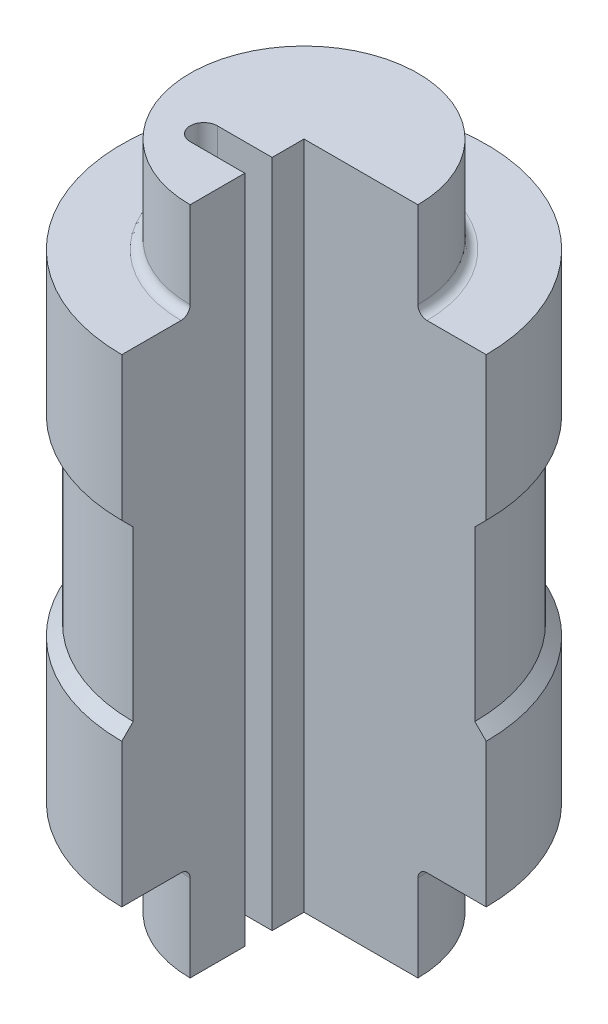
ISO-10303-21;
HEADER;
FILE_DESCRIPTION(('STEP AP214'),'2;1');
FILE_NAME('part.step','',(''),(''),'','','');
FILE_SCHEMA(('AUTOMOTIVE_DESIGN { 1 0 10303 214 1 1 1 1 }'));
ENDSEC;
DATA;
#1=APPLICATION_CONTEXT('core data for automotive mechanical design processes');
#2=APPLICATION_PROTOCOL_DEFINITION('international standard','automotive_design',2000,#1);
#3=PRODUCT_CONTEXT('',#1,'mechanical');
#4=PRODUCT('Part','Part','',(#3));
#5=PRODUCT_RELATED_PRODUCT_CATEGORY('part','',(#4));
#6=PRODUCT_DEFINITION_FORMATION('','',#4);
#7=PRODUCT_DEFINITION_CONTEXT('part definition',#1,'design');
#8=PRODUCT_DEFINITION('design','',#6,#7);
#9=PRODUCT_DEFINITION_SHAPE('','',#8);
#10=(LENGTH_UNIT() NAMED_UNIT(*) SI_UNIT(.MILLI.,.METRE.));
#11=(NAMED_UNIT(*) PLANE_ANGLE_UNIT() SI_UNIT($,.RADIAN.));
#12=(NAMED_UNIT(*) SI_UNIT($,.STERADIAN.) SOLID_ANGLE_UNIT());
#13=UNCERTAINTY_MEASURE_WITH_UNIT(LENGTH_MEASURE(1.E-05),#10,'distance_accuracy_value','');
#14=(GEOMETRIC_REPRESENTATION_CONTEXT(3) GLOBAL_UNCERTAINTY_ASSIGNED_CONTEXT((#13)) GLOBAL_UNIT_ASSIGNED_CONTEXT((#10,
#11,#12)) REPRESENTATION_CONTEXT('',''));
#15=CARTESIAN_POINT('',(0.,0.,0.));
#16=DIRECTION('',(0.,0.,1.));
#17=DIRECTION('',(1.,0.,0.));
#18=AXIS2_PLACEMENT_3D('',#15,#16,#17);
#19=CARTESIAN_POINT('',(0.,126.,0.));
#20=DIRECTION('',(-1.,0.,0.));
#21=DIRECTION('',(0.,0.,1.));
#22=AXIS2_PLACEMENT_3D('',#19,#20,#21);
#23=PLANE('',#22);
#24=DIRECTION('',(0.,0.,-1.));
#25=VECTOR('',#24,1.);
#26=CARTESIAN_POINT('',(0.,-21.,0.));
#27=LINE('',#26,#25);
#28=CARTESIAN_POINT('',(0.,-21.,25.));
#29=VERTEX_POINT('',#28);
#30=CARTESIAN_POINT('',(0.,-21.,13.));
#31=VERTEX_POINT('',#30);
#32=EDGE_CURVE('E199',#29,#31,#27,.T.);
#33=ORIENTED_EDGE('',*,*,#32,.T.);
#34=DIRECTION('',(0.,1.,0.));
#35=VECTOR('',#34,1.);
#36=CARTESIAN_POINT('',(0.,126.,13.));
#37=LINE('',#36,#35);
#38=CARTESIAN_POINT('',(0.,126.,13.));
#39=VERTEX_POINT('',#38);
#40=EDGE_CURVE('E11',#31,#39,#37,.T.);
#41=ORIENTED_EDGE('',*,*,#40,.T.);
#42=DIRECTION('',(0.,0.,-1.));
#43=VECTOR('',#42,1.);
#44=CARTESIAN_POINT('',(0.,126.,0.));
#45=LINE('',#44,#43);
#46=CARTESIAN_POINT('',(0.,126.,25.));
#47=VERTEX_POINT('',#46);
#48=EDGE_CURVE('E192',#47,#39,#45,.T.);
#49=ORIENTED_EDGE('',*,*,#48,.F.);
#50=DIRECTION('',(0.,-1.,0.));
#51=VECTOR('',#50,1.);
#52=CARTESIAN_POINT('',(0.,126.,25.));
#53=LINE('',#52,#51);
#54=CARTESIAN_POINT('',(0.,107.,25.));
#55=VERTEX_POINT('',#54);
#56=EDGE_CURVE('E253',#55,#47,#53,.F.);
#57=ORIENTED_EDGE('',*,*,#56,.F.);
#58=CARTESIAN_POINT('',(0.,107.,27.));
#59=DIRECTION('',(-1.,0.,0.));
#60=DIRECTION('',(0.,0.,1.));
#61=AXIS2_PLACEMENT_3D('',#58,#59,#60);
#62=CIRCLE('',#61,2.);
#63=CARTESIAN_POINT('',(0.,105.,27.));
#64=VERTEX_POINT('',#63);
#65=EDGE_CURVE('E250',#64,#55,#62,.F.);
#66=ORIENTED_EDGE('',*,*,#65,.F.);
#67=DIRECTION('',(0.,0.,1.));
#68=VECTOR('',#67,1.);
#69=CARTESIAN_POINT('',(0.,105.,0.));
#70=LINE('',#69,#68);
#71=CARTESIAN_POINT('',(0.,105.,40.));
#72=VERTEX_POINT('',#71);
#73=EDGE_CURVE('E248',#64,#72,#70,.T.);
#74=ORIENTED_EDGE('',*,*,#73,.T.);
#75=DIRECTION('',(0.,-1.,0.));
#76=VECTOR('',#75,1.);
#77=CARTESIAN_POINT('',(0.,105.,40.));
#78=LINE('',#77,#76);
#79=CARTESIAN_POINT('',(0.,73.5,40.));
#80=VERTEX_POINT('',#79);
#81=EDGE_CURVE('E245',#80,#72,#78,.F.);
#82=ORIENTED_EDGE('',*,*,#81,.F.);
#83=DIRECTION('',(0.,0.707106781186549,0.707106781186546));
#84=VECTOR('',#83,1.);
#85=CARTESIAN_POINT('',(0.,33.4999999999998,0.));
#86=LINE('',#85,#84);
#87=CARTESIAN_POINT('',(0.,71.,37.5));
#88=VERTEX_POINT('',#87);
#89=EDGE_CURVE('E243',#80,#88,#86,.F.);
#90=ORIENTED_EDGE('',*,*,#89,.T.);
#91=DIRECTION('',(0.,1.,0.));
#92=VECTOR('',#91,1.);
#93=CARTESIAN_POINT('',(0.,105.,37.5));
#94=LINE('',#93,#92);
#95=CARTESIAN_POINT('',(0.,34.,37.5));
#96=VERTEX_POINT('',#95);
#97=EDGE_CURVE('E241',#88,#96,#94,.F.);
#98=ORIENTED_EDGE('',*,*,#97,.T.);
#99=DIRECTION('',(0.,0.707106781186552,-0.707106781186543));
#100=VECTOR('',#99,1.);
#101=CARTESIAN_POINT('',(0.,71.5000000000006,0.));
#102=LINE('',#101,#100);
#103=CARTESIAN_POINT('',(0.,31.5,40.));
#104=VERTEX_POINT('',#103);
#105=EDGE_CURVE('E239',#96,#104,#102,.F.);
#106=ORIENTED_EDGE('',*,*,#105,.T.);
#107=DIRECTION('',(0.,-1.,0.));
#108=VECTOR('',#107,1.);
#109=CARTESIAN_POINT('',(0.,105.,40.));
#110=LINE('',#109,#108);
#111=CARTESIAN_POINT('',(0.,0.,40.));
#112=VERTEX_POINT('',#111);
#113=EDGE_CURVE('E294',#112,#104,#110,.F.);
#114=ORIENTED_EDGE('',*,*,#113,.F.);
#115=DIRECTION('',(0.,0.,1.));
#116=VECTOR('',#115,1.);
#117=CARTESIAN_POINT('',(0.,0.,0.));
#118=LINE('',#117,#116);
#119=CARTESIAN_POINT('',(0.,0.,27.));
#120=VERTEX_POINT('',#119);
#121=EDGE_CURVE('E230',#120,#112,#118,.T.);
#122=ORIENTED_EDGE('',*,*,#121,.F.);
#123=CARTESIAN_POINT('',(0.,-2.,27.));
#124=DIRECTION('',(-1.,0.,0.));
#125=DIRECTION('',(0.,0.,1.));
#126=AXIS2_PLACEMENT_3D('',#123,#124,#125);
#127=CIRCLE('',#126,2.);
#128=CARTESIAN_POINT('',(0.,-2.,25.));
#129=VERTEX_POINT('',#128);
#130=EDGE_CURVE('E233',#129,#120,#127,.F.);
#131=ORIENTED_EDGE('',*,*,#130,.F.);
#132=DIRECTION('',(0.,1.,0.));
#133=VECTOR('',#132,1.);
#134=CARTESIAN_POINT('',(0.,-21.,25.));
#135=LINE('',#134,#133);
#136=EDGE_CURVE('E236',#29,#129,#135,.T.);
#137=ORIENTED_EDGE('',*,*,#136,.F.);
#138=EDGE_LOOP('',(#33,#41,#49,#57,#66,#74,#82,#90,#98,#106,#114,#122,#131,#137));
#139=FACE_BOUND('',#138,.T.);
#140=ADVANCED_FACE('F44',(#139),#23,.F.);
#141=CARTESIAN_POINT('',(0.,105.,0.));
#142=DIRECTION('',(0.,-1.,0.));
#143=DIRECTION('',(0.,0.,-1.));
#144=AXIS2_PLACEMENT_3D('',#141,#142,#143);
#145=CYLINDRICAL_SURFACE('',#144,40.);
#146=CARTESIAN_POINT('',(0.,73.5,0.));
#147=DIRECTION('',(0.,1.,0.));
#148=DIRECTION('',(0.,0.,1.));
#149=AXIS2_PLACEMENT_3D('',#146,#147,#148);
#150=CIRCLE('',#149,40.);
#151=CARTESIAN_POINT('',(40.,73.5,0.));
#152=VERTEX_POINT('',#151);
#153=EDGE_CURVE('E265',#152,#80,#150,.T.);
#154=ORIENTED_EDGE('',*,*,#153,.T.);
#155=ORIENTED_EDGE('',*,*,#81,.T.);
#156=CARTESIAN_POINT('',(0.,105.,0.));
#157=DIRECTION('',(0.,1.,0.));
#158=DIRECTION('',(0.,0.,1.));
#159=AXIS2_PLACEMENT_3D('',#156,#157,#158);
#160=CIRCLE('',#159,40.);
#161=CARTESIAN_POINT('',(40.,105.,0.));
#162=VERTEX_POINT('',#161);
#163=EDGE_CURVE('E275',#162,#72,#160,.T.);
#164=ORIENTED_EDGE('',*,*,#163,.F.);
#165=DIRECTION('',(0.,-1.,0.));
#166=VECTOR('',#165,1.);
#167=CARTESIAN_POINT('',(40.,105.,0.));
#168=LINE('',#167,#166);
#169=EDGE_CURVE('E219',#162,#152,#168,.T.);
#170=ORIENTED_EDGE('',*,*,#169,.T.);
#171=EDGE_LOOP('',(#154,#155,#164,#170));
#172=FACE_BOUND('',#171,.T.);
#173=ADVANCED_FACE('F336',(#172),#145,.T.);
#174=CARTESIAN_POINT('',(0.,105.,0.));
#175=DIRECTION('',(0.,1.,0.));
#176=DIRECTION('',(0.,0.,1.));
#177=AXIS2_PLACEMENT_3D('',#174,#175,#176);
#178=PLANE('',#177);
#179=ORIENTED_EDGE('',*,*,#73,.F.);
#180=CARTESIAN_POINT('',(0.,105.,0.));
#181=DIRECTION('',(0.,1.,0.));
#182=DIRECTION('',(0.,0.,1.));
#183=AXIS2_PLACEMENT_3D('',#180,#181,#182);
#184=CIRCLE('',#183,27.);
#185=CARTESIAN_POINT('',(27.,105.,0.));
#186=VERTEX_POINT('',#185);
#187=EDGE_CURVE('E289',#64,#186,#184,.F.);
#188=ORIENTED_EDGE('',*,*,#187,.T.);
#189=DIRECTION('',(-1.,0.,0.));
#190=VECTOR('',#189,1.);
#191=CARTESIAN_POINT('',(0.,105.,0.));
#192=LINE('',#191,#190);
#193=EDGE_CURVE('E222',#162,#186,#192,.T.);
#194=ORIENTED_EDGE('',*,*,#193,.F.);
#195=ORIENTED_EDGE('',*,*,#163,.T.);
#196=EDGE_LOOP('',(#179,#188,#194,#195));
#197=FACE_BOUND('',#196,.T.);
#198=ADVANCED_FACE('F341',(#197),#178,.T.);
#199=CARTESIAN_POINT('',(0.,126.,0.));
#200=DIRECTION('',(0.,-1.,0.));
#201=DIRECTION('',(0.,0.,-1.));
#202=AXIS2_PLACEMENT_3D('',#199,#200,#201);
#203=CYLINDRICAL_SURFACE('',#202,25.);
#204=CARTESIAN_POINT('',(0.,107.,0.));
#205=DIRECTION('',(0.,1.,0.));
#206=DIRECTION('',(0.,0.,1.));
#207=AXIS2_PLACEMENT_3D('',#204,#205,#206);
#208=CIRCLE('',#207,25.);
#209=CARTESIAN_POINT('',(25.,107.,0.));
#210=VERTEX_POINT('',#209);
#211=EDGE_CURVE('E286',#210,#55,#208,.T.);
#212=ORIENTED_EDGE('',*,*,#211,.T.);
#213=ORIENTED_EDGE('',*,*,#56,.T.);
#214=CARTESIAN_POINT('',(0.,126.,0.));
#215=DIRECTION('',(0.,1.,0.));
#216=DIRECTION('',(0.,0.,1.));
#217=AXIS2_PLACEMENT_3D('',#214,#215,#216);
#218=CIRCLE('',#217,25.);
#219=CARTESIAN_POINT('',(25.,126.,0.));
#220=VERTEX_POINT('',#219);
#221=EDGE_CURVE('E271',#220,#47,#218,.T.);
#222=ORIENTED_EDGE('',*,*,#221,.F.);
#223=DIRECTION('',(0.,-1.,0.));
#224=VECTOR('',#223,1.);
#225=CARTESIAN_POINT('',(25.,126.,0.));
#226=LINE('',#225,#224);
#227=EDGE_CURVE('E227',#220,#210,#226,.T.);
#228=ORIENTED_EDGE('',*,*,#227,.T.);
#229=EDGE_LOOP('',(#212,#213,#222,#228));
#230=FACE_BOUND('',#229,.T.);
#231=ADVANCED_FACE('F347',(#230),#203,.T.);
#232=CARTESIAN_POINT('',(0.,126.,0.));
#233=DIRECTION('',(0.,1.,0.));
#234=DIRECTION('',(0.,0.,1.));
#235=AXIS2_PLACEMENT_3D('',#232,#233,#234);
#236=PLANE('',#235);
#237=DIRECTION('',(-1.,0.,0.));
#238=VECTOR('',#237,1.);
#239=CARTESIAN_POINT('',(-12.,126.,13.));
#240=LINE('',#239,#238);
#241=CARTESIAN_POINT('',(-12.,126.,13.));
#242=VERTEX_POINT('',#241);
#243=EDGE_CURVE('E173',#39,#242,#240,.T.);
#244=ORIENTED_EDGE('',*,*,#243,.T.);
#245=CARTESIAN_POINT('',(-12.,126.,10.));
#246=DIRECTION('',(0.,-1.,0.));
#247=DIRECTION('',(0.,0.,-1.));
#248=AXIS2_PLACEMENT_3D('',#245,#246,#247);
#249=CIRCLE('',#248,3.);
#250=CARTESIAN_POINT('',(-12.,126.,7.));
#251=VERTEX_POINT('',#250);
#252=EDGE_CURVE('E168',#242,#251,#249,.T.);
#253=ORIENTED_EDGE('',*,*,#252,.T.);
#254=DIRECTION('',(1.,0.,0.));
#255=VECTOR('',#254,1.);
#256=CARTESIAN_POINT('',(-12.,126.,7.));
#257=LINE('',#256,#255);
#258=CARTESIAN_POINT('',(0.,126.,7.));
#259=VERTEX_POINT('',#258);
#260=EDGE_CURVE('E176',#251,#259,#257,.T.);
#261=ORIENTED_EDGE('',*,*,#260,.T.);
#262=CARTESIAN_POINT('',(0.,126.,0.));
#263=VERTEX_POINT('',#262);
#264=EDGE_CURVE('E195',#259,#263,#45,.T.);
#265=ORIENTED_EDGE('',*,*,#264,.T.);
#266=DIRECTION('',(1.,0.,0.));
#267=VECTOR('',#266,1.);
#268=CARTESIAN_POINT('',(0.,126.,0.));
#269=LINE('',#268,#267);
#270=EDGE_CURVE('E194',#263,#220,#269,.T.);
#271=ORIENTED_EDGE('',*,*,#270,.T.);
#272=ORIENTED_EDGE('',*,*,#221,.T.);
#273=ORIENTED_EDGE('',*,*,#48,.T.);
#274=EDGE_LOOP('',(#244,#253,#261,#265,#271,#272,#273));
#275=FACE_BOUND('',#274,.T.);
#276=ADVANCED_FACE('F181',(#275),#236,.T.);
#277=CARTESIAN_POINT('',(0.,107.,0.));
#278=DIRECTION('',(0.,1.,0.));
#279=DIRECTION('',(0.,0.,1.));
#280=AXIS2_PLACEMENT_3D('',#277,#278,#279);
#281=TOROIDAL_SURFACE('',#280,27.,2.);
#282=ORIENTED_EDGE('',*,*,#187,.F.);
#283=ORIENTED_EDGE('',*,*,#65,.T.);
#284=ORIENTED_EDGE('',*,*,#211,.F.);
#285=CARTESIAN_POINT('',(27.,107.,0.));
#286=DIRECTION('',(0.,0.,-1.));
#287=DIRECTION('',(-1.,0.,0.));
#288=AXIS2_PLACEMENT_3D('',#285,#286,#287);
#289=CIRCLE('',#288,2.);
#290=EDGE_CURVE('E224',#210,#186,#289,.F.);
#291=ORIENTED_EDGE('',*,*,#290,.T.);
#292=EDGE_LOOP('',(#282,#283,#284,#291));
#293=FACE_BOUND('',#292,.T.);
#294=ADVANCED_FACE('F46',(#293),#281,.F.);
#295=CARTESIAN_POINT('',(0.,73.5,0.));
#296=DIRECTION('',(0.,1.,0.));
#297=DIRECTION('',(0.,0.,1.));
#298=AXIS2_PLACEMENT_3D('',#295,#296,#297);
#299=CONICAL_SURFACE('',#298,40.,0.785398163397446);
#300=ORIENTED_EDGE('',*,*,#89,.F.);
#301=ORIENTED_EDGE('',*,*,#153,.F.);
#302=DIRECTION('',(-0.707106781186546,-0.707106781186549,0.));
#303=VECTOR('',#302,1.);
#304=CARTESIAN_POINT('',(0.,33.4999999999998,0.));
#305=LINE('',#304,#303);
#306=CARTESIAN_POINT('',(37.5,71.,0.));
#307=VERTEX_POINT('',#306);
#308=EDGE_CURVE('E217',#307,#152,#305,.F.);
#309=ORIENTED_EDGE('',*,*,#308,.F.);
#310=CARTESIAN_POINT('',(0.,71.,0.));
#311=DIRECTION('',(0.,1.,0.));
#312=DIRECTION('',(0.,0.,1.));
#313=AXIS2_PLACEMENT_3D('',#310,#311,#312);
#314=CIRCLE('',#313,37.5);
#315=EDGE_CURVE('E262',#307,#88,#314,.T.);
#316=ORIENTED_EDGE('',*,*,#315,.T.);
#317=EDGE_LOOP('',(#300,#301,#309,#316));
#318=FACE_BOUND('',#317,.T.);
#319=ADVANCED_FACE('F334',(#318),#299,.T.);
#320=CARTESIAN_POINT('',(0.,105.,0.));
#321=DIRECTION('',(0.,1.,0.));
#322=DIRECTION('',(0.,0.,1.));
#323=AXIS2_PLACEMENT_3D('',#320,#321,#322);
#324=CYLINDRICAL_SURFACE('',#323,37.5);
#325=ORIENTED_EDGE('',*,*,#97,.F.);
#326=ORIENTED_EDGE('',*,*,#315,.F.);
#327=DIRECTION('',(0.,1.,0.));
#328=VECTOR('',#327,1.);
#329=CARTESIAN_POINT('',(37.5,105.,0.));
#330=LINE('',#329,#328);
#331=CARTESIAN_POINT('',(37.5,34.,0.));
#332=VERTEX_POINT('',#331);
#333=EDGE_CURVE('E215',#332,#307,#330,.T.);
#334=ORIENTED_EDGE('',*,*,#333,.F.);
#335=CARTESIAN_POINT('',(0.,34.,0.));
#336=DIRECTION('',(0.,1.,0.));
#337=DIRECTION('',(0.,0.,1.));
#338=AXIS2_PLACEMENT_3D('',#335,#336,#337);
#339=CIRCLE('',#338,37.5);
#340=EDGE_CURVE('E259',#332,#96,#339,.T.);
#341=ORIENTED_EDGE('',*,*,#340,.T.);
#342=EDGE_LOOP('',(#325,#326,#334,#341));
#343=FACE_BOUND('',#342,.T.);
#344=ADVANCED_FACE('F328',(#343),#324,.T.);
#345=CARTESIAN_POINT('',(0.,34.,0.));
#346=DIRECTION('',(0.,-1.,0.));
#347=DIRECTION('',(0.,0.,-1.));
#348=AXIS2_PLACEMENT_3D('',#345,#346,#347);
#349=CONICAL_SURFACE('',#348,37.5,0.785398163397442);
#350=ORIENTED_EDGE('',*,*,#105,.F.);
#351=ORIENTED_EDGE('',*,*,#340,.F.);
#352=DIRECTION('',(0.707106781186543,-0.707106781186552,0.));
#353=VECTOR('',#352,1.);
#354=CARTESIAN_POINT('',(0.,71.5000000000006,0.));
#355=LINE('',#354,#353);
#356=CARTESIAN_POINT('',(40.,31.5,0.));
#357=VERTEX_POINT('',#356);
#358=EDGE_CURVE('E213',#357,#332,#355,.F.);
#359=ORIENTED_EDGE('',*,*,#358,.F.);
#360=CARTESIAN_POINT('',(0.,31.5,0.));
#361=DIRECTION('',(0.,1.,0.));
#362=DIRECTION('',(0.,0.,1.));
#363=AXIS2_PLACEMENT_3D('',#360,#361,#362);
#364=CIRCLE('',#363,40.);
#365=EDGE_CURVE('E256',#357,#104,#364,.T.);
#366=ORIENTED_EDGE('',*,*,#365,.T.);
#367=EDGE_LOOP('',(#350,#351,#359,#366));
#368=FACE_BOUND('',#367,.T.);
#369=ADVANCED_FACE('F325',(#368),#349,.T.);
#370=CARTESIAN_POINT('',(0.,-21.,0.));
#371=DIRECTION('',(0.,-1.,0.));
#372=DIRECTION('',(0.,0.,-1.));
#373=AXIS2_PLACEMENT_3D('',#370,#371,#372);
#374=PLANE('',#373);
#375=DIRECTION('',(-1.,0.,0.));
#376=VECTOR('',#375,1.);
#377=CARTESIAN_POINT('',(-12.,-21.,13.));
#378=LINE('',#377,#376);
#379=CARTESIAN_POINT('',(-12.,-21.,13.));
#380=VERTEX_POINT('',#379);
#381=EDGE_CURVE('E183',#31,#380,#378,.T.);
#382=ORIENTED_EDGE('',*,*,#381,.F.);
#383=ORIENTED_EDGE('',*,*,#32,.F.);
#384=CARTESIAN_POINT('',(0.,-21.,0.));
#385=DIRECTION('',(0.,-1.,0.));
#386=DIRECTION('',(0.,0.,-1.));
#387=AXIS2_PLACEMENT_3D('',#384,#385,#386);
#388=CIRCLE('',#387,25.);
#389=CARTESIAN_POINT('',(25.,-21.,0.));
#390=VERTEX_POINT('',#389);
#391=EDGE_CURVE('E268',#29,#390,#388,.T.);
#392=ORIENTED_EDGE('',*,*,#391,.T.);
#393=DIRECTION('',(1.,0.,0.));
#394=VECTOR('',#393,1.);
#395=CARTESIAN_POINT('',(0.,-21.,0.));
#396=LINE('',#395,#394);
#397=CARTESIAN_POINT('',(0.,-21.,0.));
#398=VERTEX_POINT('',#397);
#399=EDGE_CURVE('E202',#398,#390,#396,.T.);
#400=ORIENTED_EDGE('',*,*,#399,.F.);
#401=CARTESIAN_POINT('',(0.,-21.,7.));
#402=VERTEX_POINT('',#401);
#403=EDGE_CURVE('E190',#402,#398,#27,.T.);
#404=ORIENTED_EDGE('',*,*,#403,.F.);
#405=DIRECTION('',(1.,0.,0.));
#406=VECTOR('',#405,1.);
#407=CARTESIAN_POINT('',(-12.,-21.,7.));
#408=LINE('',#407,#406);
#409=CARTESIAN_POINT('',(-12.,-21.,7.));
#410=VERTEX_POINT('',#409);
#411=EDGE_CURVE('E59',#410,#402,#408,.T.);
#412=ORIENTED_EDGE('',*,*,#411,.F.);
#413=CARTESIAN_POINT('',(-12.,-21.,10.));
#414=DIRECTION('',(0.,-1.,0.));
#415=DIRECTION('',(0.,0.,-1.));
#416=AXIS2_PLACEMENT_3D('',#413,#414,#415);
#417=CIRCLE('',#416,3.);
#418=EDGE_CURVE('E171',#380,#410,#417,.T.);
#419=ORIENTED_EDGE('',*,*,#418,.F.);
#420=EDGE_LOOP('',(#382,#383,#392,#400,#404,#412,#419));
#421=FACE_BOUND('',#420,.T.);
#422=ADVANCED_FACE('F303',(#421),#374,.T.);
#423=CARTESIAN_POINT('',(0.,-21.,0.));
#424=DIRECTION('',(0.,1.,0.));
#425=DIRECTION('',(0.,0.,1.));
#426=AXIS2_PLACEMENT_3D('',#423,#424,#425);
#427=CYLINDRICAL_SURFACE('',#426,25.);
#428=ORIENTED_EDGE('',*,*,#391,.F.);
#429=ORIENTED_EDGE('',*,*,#136,.T.);
#430=CARTESIAN_POINT('',(0.,-2.,0.));
#431=DIRECTION('',(0.,1.,0.));
#432=DIRECTION('',(0.,0.,1.));
#433=AXIS2_PLACEMENT_3D('',#430,#431,#432);
#434=CIRCLE('',#433,25.);
#435=CARTESIAN_POINT('',(25.,-2.,0.));
#436=VERTEX_POINT('',#435);
#437=EDGE_CURVE('E278',#129,#436,#434,.F.);
#438=ORIENTED_EDGE('',*,*,#437,.T.);
#439=DIRECTION('',(0.,1.,0.));
#440=VECTOR('',#439,1.);
#441=CARTESIAN_POINT('',(25.,-21.,0.));
#442=LINE('',#441,#440);
#443=EDGE_CURVE('E210',#436,#390,#442,.F.);
#444=ORIENTED_EDGE('',*,*,#443,.T.);
#445=EDGE_LOOP('',(#428,#429,#438,#444));
#446=FACE_BOUND('',#445,.T.);
#447=ADVANCED_FACE('F309',(#446),#427,.T.);
#448=CARTESIAN_POINT('',(0.,-2.,0.));
#449=DIRECTION('',(0.,1.,0.));
#450=DIRECTION('',(0.,0.,1.));
#451=AXIS2_PLACEMENT_3D('',#448,#449,#450);
#452=TOROIDAL_SURFACE('',#451,27.,2.);
#453=ORIENTED_EDGE('',*,*,#437,.F.);
#454=ORIENTED_EDGE('',*,*,#130,.T.);
#455=CARTESIAN_POINT('',(0.,0.,0.));
#456=DIRECTION('',(0.,1.,0.));
#457=DIRECTION('',(0.,0.,1.));
#458=AXIS2_PLACEMENT_3D('',#455,#456,#457);
#459=CIRCLE('',#458,27.);
#460=CARTESIAN_POINT('',(27.,0.,0.));
#461=VERTEX_POINT('',#460);
#462=EDGE_CURVE('E283',#461,#120,#459,.T.);
#463=ORIENTED_EDGE('',*,*,#462,.F.);
#464=CARTESIAN_POINT('',(27.,-2.,0.));
#465=DIRECTION('',(0.,0.,-1.));
#466=DIRECTION('',(-1.,0.,0.));
#467=AXIS2_PLACEMENT_3D('',#464,#465,#466);
#468=CIRCLE('',#467,2.);
#469=EDGE_CURVE('E207',#461,#436,#468,.F.);
#470=ORIENTED_EDGE('',*,*,#469,.T.);
#471=EDGE_LOOP('',(#453,#454,#463,#470));
#472=FACE_BOUND('',#471,.T.);
#473=ADVANCED_FACE('F312',(#472),#452,.F.);
#474=CARTESIAN_POINT('',(0.,0.,0.));
#475=DIRECTION('',(0.,1.,0.));
#476=DIRECTION('',(0.,0.,1.));
#477=AXIS2_PLACEMENT_3D('',#474,#475,#476);
#478=PLANE('',#477);
#479=ORIENTED_EDGE('',*,*,#462,.T.);
#480=ORIENTED_EDGE('',*,*,#121,.T.);
#481=CARTESIAN_POINT('',(0.,0.,0.));
#482=DIRECTION('',(0.,1.,0.));
#483=DIRECTION('',(0.,0.,1.));
#484=AXIS2_PLACEMENT_3D('',#481,#482,#483);
#485=CIRCLE('',#484,40.);
#486=CARTESIAN_POINT('',(40.,0.,0.));
#487=VERTEX_POINT('',#486);
#488=EDGE_CURVE('E274',#487,#112,#485,.T.);
#489=ORIENTED_EDGE('',*,*,#488,.F.);
#490=DIRECTION('',(-1.,0.,0.));
#491=VECTOR('',#490,1.);
#492=CARTESIAN_POINT('',(0.,0.,0.));
#493=LINE('',#492,#491);
#494=EDGE_CURVE('E67',#487,#461,#493,.T.);
#495=ORIENTED_EDGE('',*,*,#494,.T.);
#496=EDGE_LOOP('',(#479,#480,#489,#495));
#497=FACE_BOUND('',#496,.T.);
#498=ADVANCED_FACE('F316',(#497),#478,.F.);
#499=ORIENTED_EDGE('',*,*,#488,.T.);
#500=ORIENTED_EDGE('',*,*,#113,.T.);
#501=ORIENTED_EDGE('',*,*,#365,.F.);
#502=DIRECTION('',(0.,-1.,0.));
#503=VECTOR('',#502,1.);
#504=CARTESIAN_POINT('',(40.,105.,0.));
#505=LINE('',#504,#503);
#506=EDGE_CURVE('E292',#357,#487,#505,.T.);
#507=ORIENTED_EDGE('',*,*,#506,.T.);
#508=EDGE_LOOP('',(#499,#500,#501,#507));
#509=FACE_BOUND('',#508,.T.);
#510=ADVANCED_FACE('F318',(#509),#145,.T.);
#511=ORIENTED_EDGE('',*,*,#264,.F.);
#512=DIRECTION('',(0.,-1.,0.));
#513=VECTOR('',#512,1.);
#514=CARTESIAN_POINT('',(0.,126.,7.));
#515=LINE('',#514,#513);
#516=EDGE_CURVE('E52',#259,#402,#515,.T.);
#517=ORIENTED_EDGE('',*,*,#516,.T.);
#518=ORIENTED_EDGE('',*,*,#403,.T.);
#519=DIRECTION('',(0.,-1.,0.));
#520=VECTOR('',#519,1.);
#521=CARTESIAN_POINT('',(0.,126.,0.));
#522=LINE('',#521,#520);
#523=EDGE_CURVE('E198',#263,#398,#522,.T.);
#524=ORIENTED_EDGE('',*,*,#523,.F.);
#525=EDGE_LOOP('',(#511,#517,#518,#524));
#526=FACE_BOUND('',#525,.T.);
#527=ADVANCED_FACE('F298',(#526),#23,.F.);
#528=CARTESIAN_POINT('',(0.,126.,0.));
#529=DIRECTION('',(0.,0.,-1.));
#530=DIRECTION('',(-1.,0.,0.));
#531=AXIS2_PLACEMENT_3D('',#528,#529,#530);
#532=PLANE('',#531);
#533=ORIENTED_EDGE('',*,*,#270,.F.);
#534=ORIENTED_EDGE('',*,*,#523,.T.);
#535=ORIENTED_EDGE('',*,*,#399,.T.);
#536=ORIENTED_EDGE('',*,*,#443,.F.);
#537=ORIENTED_EDGE('',*,*,#469,.F.);
#538=ORIENTED_EDGE('',*,*,#494,.F.);
#539=ORIENTED_EDGE('',*,*,#506,.F.);
#540=ORIENTED_EDGE('',*,*,#358,.T.);
#541=ORIENTED_EDGE('',*,*,#333,.T.);
#542=ORIENTED_EDGE('',*,*,#308,.T.);
#543=ORIENTED_EDGE('',*,*,#169,.F.);
#544=ORIENTED_EDGE('',*,*,#193,.T.);
#545=ORIENTED_EDGE('',*,*,#290,.F.);
#546=ORIENTED_EDGE('',*,*,#227,.F.);
#547=EDGE_LOOP('',(#533,#534,#535,#536,#537,#538,#539,#540,#541,#542,#543,#544,#545,#546));
#548=FACE_BOUND('',#547,.T.);
#549=ADVANCED_FACE('F307',(#548),#532,.F.);
#550=CARTESIAN_POINT('',(-12.,126.,13.));
#551=DIRECTION('',(0.,0.,1.));
#552=DIRECTION('',(1.,0.,0.));
#553=AXIS2_PLACEMENT_3D('',#550,#551,#552);
#554=PLANE('',#553);
#555=ORIENTED_EDGE('',*,*,#381,.T.);
#556=DIRECTION('',(0.,-1.,0.));
#557=VECTOR('',#556,1.);
#558=CARTESIAN_POINT('',(-12.,126.,13.));
#559=LINE('',#558,#557);
#560=EDGE_CURVE('E172',#242,#380,#559,.T.);
#561=ORIENTED_EDGE('',*,*,#560,.F.);
#562=ORIENTED_EDGE('',*,*,#243,.F.);
#563=ORIENTED_EDGE('',*,*,#40,.F.);
#564=EDGE_LOOP('',(#555,#561,#562,#563));
#565=FACE_BOUND('',#564,.T.);
#566=ADVANCED_FACE('F350',(#565),#554,.F.);
#567=CARTESIAN_POINT('',(-12.,126.,7.));
#568=DIRECTION('',(0.,0.,-1.));
#569=DIRECTION('',(-1.,0.,0.));
#570=AXIS2_PLACEMENT_3D('',#567,#568,#569);
#571=PLANE('',#570);
#572=ORIENTED_EDGE('',*,*,#260,.F.);
#573=DIRECTION('',(0.,-1.,0.));
#574=VECTOR('',#573,1.);
#575=CARTESIAN_POINT('',(-12.,126.,7.));
#576=LINE('',#575,#574);
#577=EDGE_CURVE('E163',#251,#410,#576,.T.);
#578=ORIENTED_EDGE('',*,*,#577,.T.);
#579=ORIENTED_EDGE('',*,*,#411,.T.);
#580=ORIENTED_EDGE('',*,*,#516,.F.);
#581=EDGE_LOOP('',(#572,#578,#579,#580));
#582=FACE_BOUND('',#581,.T.);
#583=ADVANCED_FACE('F177',(#582),#571,.F.);
#584=CARTESIAN_POINT('',(-12.,126.,10.));
#585=DIRECTION('',(0.,-1.,0.));
#586=DIRECTION('',(0.,0.,-1.));
#587=AXIS2_PLACEMENT_3D('',#584,#585,#586);
#588=CYLINDRICAL_SURFACE('',#587,3.);
#589=ORIENTED_EDGE('',*,*,#418,.T.);
#590=ORIENTED_EDGE('',*,*,#577,.F.);
#591=ORIENTED_EDGE('',*,*,#252,.F.);
#592=ORIENTED_EDGE('',*,*,#560,.T.);
#593=EDGE_LOOP('',(#589,#590,#591,#592));
#594=FACE_BOUND('',#593,.T.);
#595=ADVANCED_FACE('F165',(#594),#588,.F.);
#596=CLOSED_SHELL('',(#140,#173,#198,#231,#276,#294,#319,#344,#369,#422,#447,#473,#498,#510,
#527,#549,#566,#583,#595));
#597=MANIFOLD_SOLID_BREP('B2',#596);
#598=ADVANCED_BREP_SHAPE_REPRESENTATION('',(#18,#597),#14);
#599=SHAPE_DEFINITION_REPRESENTATION(#9,#598);
ENDSEC;
END-ISO-10303-21;
